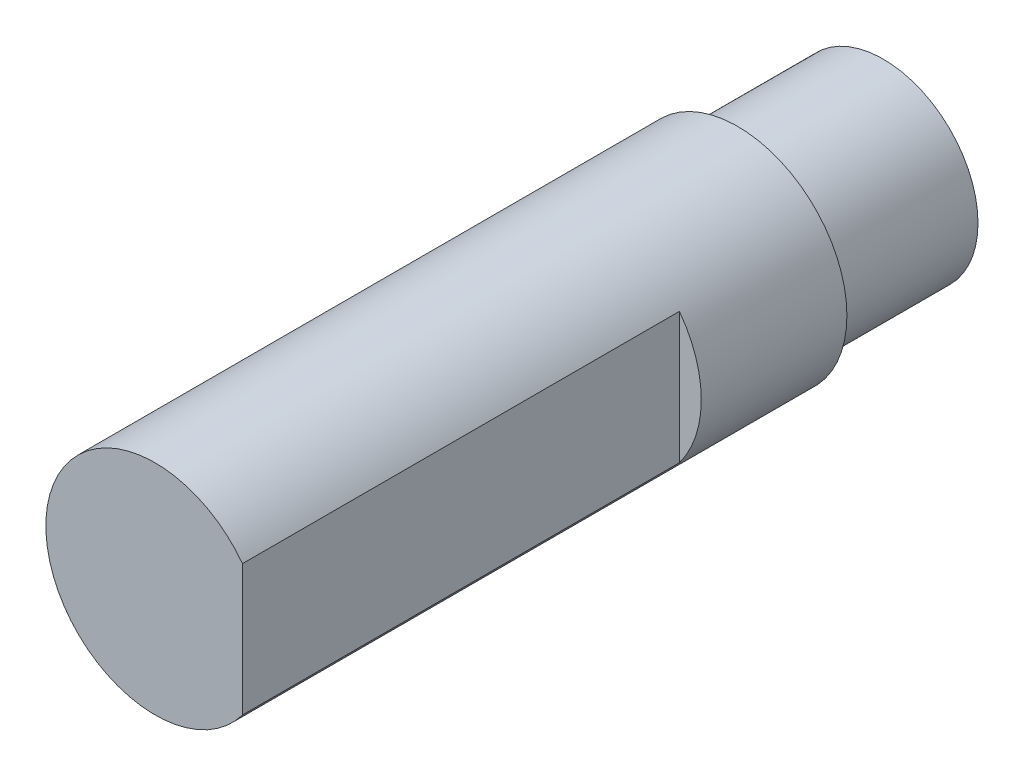
ISO-10303-21;
HEADER;
FILE_DESCRIPTION(('STEP AP214'),'2;1');
FILE_NAME('part.step','',(''),(''),'','','');
FILE_SCHEMA(('AUTOMOTIVE_DESIGN { 1 0 10303 214 1 1 1 1 }'));
ENDSEC;
DATA;
#1=APPLICATION_CONTEXT('core data for automotive mechanical design processes');
#2=APPLICATION_PROTOCOL_DEFINITION('international standard','automotive_design',2000,#1);
#3=PRODUCT_CONTEXT('',#1,'mechanical');
#4=PRODUCT('Part','Part','',(#3));
#5=PRODUCT_RELATED_PRODUCT_CATEGORY('part','',(#4));
#6=PRODUCT_DEFINITION_FORMATION('','',#4);
#7=PRODUCT_DEFINITION_CONTEXT('part definition',#1,'design');
#8=PRODUCT_DEFINITION('design','',#6,#7);
#9=PRODUCT_DEFINITION_SHAPE('','',#8);
#10=(LENGTH_UNIT() NAMED_UNIT(*) SI_UNIT(.MILLI.,.METRE.));
#11=(NAMED_UNIT(*) PLANE_ANGLE_UNIT() SI_UNIT($,.RADIAN.));
#12=(NAMED_UNIT(*) SI_UNIT($,.STERADIAN.) SOLID_ANGLE_UNIT());
#13=UNCERTAINTY_MEASURE_WITH_UNIT(LENGTH_MEASURE(1.E-05),#10,'distance_accuracy_value','');
#14=(GEOMETRIC_REPRESENTATION_CONTEXT(3) GLOBAL_UNCERTAINTY_ASSIGNED_CONTEXT((#13)) GLOBAL_UNIT_ASSIGNED_CONTEXT((#10,
#11,#12)) REPRESENTATION_CONTEXT('',''));
#15=CARTESIAN_POINT('',(0.,0.,0.));
#16=DIRECTION('',(0.,0.,1.));
#17=DIRECTION('',(1.,0.,0.));
#18=AXIS2_PLACEMENT_3D('',#15,#16,#17);
#19=CARTESIAN_POINT('',(0.,0.,22.));
#20=DIRECTION('',(0.,0.,-1.));
#21=DIRECTION('',(-1.,0.,0.));
#22=AXIS2_PLACEMENT_3D('',#19,#20,#21);
#23=CYLINDRICAL_SURFACE('',#22,3.);
#24=CARTESIAN_POINT('',(0.,0.,6.));
#25=DIRECTION('',(0.,0.,1.));
#26=DIRECTION('',(1.,0.,0.));
#27=AXIS2_PLACEMENT_3D('',#24,#25,#26);
#28=CIRCLE('',#27,3.);
#29=CARTESIAN_POINT('',(3.,0.,6.));
#30=VERTEX_POINT('',#29);
#31=EDGE_CURVE('E73',#30,#30,#28,.T.);
#32=ORIENTED_EDGE('',*,*,#31,.T.);
#33=EDGE_LOOP('',(#32));
#34=FACE_BOUND('',#33,.T.);
#35=DIRECTION('',(0.,0.,-1.));
#36=VECTOR('',#35,1.);
#37=CARTESIAN_POINT('',(2.4,-1.8,22.));
#38=LINE('',#37,#36);
#39=CARTESIAN_POINT('',(2.4,-1.8,22.));
#40=VERTEX_POINT('',#39);
#41=CARTESIAN_POINT('',(2.4,-1.8,10.));
#42=VERTEX_POINT('',#41);
#43=EDGE_CURVE('E68',#40,#42,#38,.T.);
#44=ORIENTED_EDGE('',*,*,#43,.F.);
#45=CARTESIAN_POINT('',(0.,0.,22.));
#46=DIRECTION('',(0.,0.,1.));
#47=DIRECTION('',(1.,0.,0.));
#48=AXIS2_PLACEMENT_3D('',#45,#46,#47);
#49=CIRCLE('',#48,3.);
#50=CARTESIAN_POINT('',(2.4,1.8,22.));
#51=VERTEX_POINT('',#50);
#52=EDGE_CURVE('E75',#51,#40,#49,.T.);
#53=ORIENTED_EDGE('',*,*,#52,.F.);
#54=DIRECTION('',(0.,0.,-1.));
#55=VECTOR('',#54,1.);
#56=CARTESIAN_POINT('',(2.4,1.8,22.));
#57=LINE('',#56,#55);
#58=CARTESIAN_POINT('',(2.4,1.8,10.));
#59=VERTEX_POINT('',#58);
#60=EDGE_CURVE('E52',#59,#51,#57,.F.);
#61=ORIENTED_EDGE('',*,*,#60,.F.);
#62=CARTESIAN_POINT('',(0.,0.,10.));
#63=DIRECTION('',(0.,0.,1.));
#64=DIRECTION('',(1.,0.,0.));
#65=AXIS2_PLACEMENT_3D('',#62,#63,#64);
#66=CIRCLE('',#65,3.);
#67=EDGE_CURVE('E11',#42,#59,#66,.T.);
#68=ORIENTED_EDGE('',*,*,#67,.F.);
#69=EDGE_LOOP('',(#44,#53,#61,#68));
#70=FACE_BOUND('',#69,.T.);
#71=ADVANCED_FACE('F39',(#34,#70),#23,.T.);
#72=CARTESIAN_POINT('',(0.,0.,22.));
#73=DIRECTION('',(0.,0.,1.));
#74=DIRECTION('',(1.,0.,0.));
#75=AXIS2_PLACEMENT_3D('',#72,#73,#74);
#76=PLANE('',#75);
#77=ORIENTED_EDGE('',*,*,#52,.T.);
#78=DIRECTION('',(0.,1.,0.));
#79=VECTOR('',#78,1.);
#80=CARTESIAN_POINT('',(2.4,0.,22.));
#81=LINE('',#80,#79);
#82=EDGE_CURVE('E46',#40,#51,#81,.T.);
#83=ORIENTED_EDGE('',*,*,#82,.T.);
#84=EDGE_LOOP('',(#77,#83));
#85=FACE_BOUND('',#84,.T.);
#86=ADVANCED_FACE('F85',(#85),#76,.T.);
#87=CARTESIAN_POINT('',(0.,0.,6.));
#88=DIRECTION('',(0.,0.,1.));
#89=DIRECTION('',(1.,0.,0.));
#90=AXIS2_PLACEMENT_3D('',#87,#88,#89);
#91=PLANE('',#90);
#92=CARTESIAN_POINT('',(0.,0.,6.));
#93=DIRECTION('',(0.,0.,1.));
#94=DIRECTION('',(1.,0.,0.));
#95=AXIS2_PLACEMENT_3D('',#92,#93,#94);
#96=CIRCLE('',#95,2.6);
#97=CARTESIAN_POINT('',(2.6,0.,6.));
#98=VERTEX_POINT('',#97);
#99=EDGE_CURVE('E67',#98,#98,#96,.T.);
#100=ORIENTED_EDGE('',*,*,#99,.T.);
#101=EDGE_LOOP('',(#100));
#102=FACE_BOUND('',#101,.T.);
#103=ORIENTED_EDGE('',*,*,#31,.F.);
#104=EDGE_LOOP('',(#103));
#105=FACE_BOUND('',#104,.T.);
#106=ADVANCED_FACE('F81',(#102,#105),#91,.F.);
#107=CARTESIAN_POINT('',(0.,0.,10.));
#108=DIRECTION('',(0.,0.,1.));
#109=DIRECTION('',(1.,0.,0.));
#110=AXIS2_PLACEMENT_3D('',#107,#108,#109);
#111=PLANE('',#110);
#112=ORIENTED_EDGE('',*,*,#67,.T.);
#113=DIRECTION('',(0.,-1.,0.));
#114=VECTOR('',#113,1.);
#115=CARTESIAN_POINT('',(2.4,4.,10.));
#116=LINE('',#115,#114);
#117=EDGE_CURVE('E63',#59,#42,#116,.T.);
#118=ORIENTED_EDGE('',*,*,#117,.T.);
#119=EDGE_LOOP('',(#112,#118));
#120=FACE_BOUND('',#119,.T.);
#121=ADVANCED_FACE('F61',(#120),#111,.T.);
#122=CARTESIAN_POINT('',(2.4,4.,22.2));
#123=DIRECTION('',(1.,0.,0.));
#124=DIRECTION('',(0.,0.,-1.));
#125=AXIS2_PLACEMENT_3D('',#122,#123,#124);
#126=PLANE('',#125);
#127=ORIENTED_EDGE('',*,*,#43,.T.);
#128=ORIENTED_EDGE('',*,*,#117,.F.);
#129=ORIENTED_EDGE('',*,*,#60,.T.);
#130=ORIENTED_EDGE('',*,*,#82,.F.);
#131=EDGE_LOOP('',(#127,#128,#129,#130));
#132=FACE_BOUND('',#131,.T.);
#133=ADVANCED_FACE('F70',(#132),#126,.T.);
#134=CARTESIAN_POINT('',(0.,0.,6.));
#135=DIRECTION('',(0.,0.,-1.));
#136=DIRECTION('',(-1.,0.,0.));
#137=AXIS2_PLACEMENT_3D('',#134,#135,#136);
#138=CYLINDRICAL_SURFACE('',#137,2.6);
#139=ORIENTED_EDGE('',*,*,#99,.F.);
#140=EDGE_LOOP('',(#139));
#141=FACE_BOUND('',#140,.T.);
#142=CARTESIAN_POINT('',(0.,0.,2.));
#143=DIRECTION('',(0.,0.,1.));
#144=DIRECTION('',(1.,0.,0.));
#145=AXIS2_PLACEMENT_3D('',#142,#143,#144);
#146=CIRCLE('',#145,2.6);
#147=CARTESIAN_POINT('',(2.6,0.,2.));
#148=VERTEX_POINT('',#147);
#149=EDGE_CURVE('E108',#148,#148,#146,.T.);
#150=ORIENTED_EDGE('',*,*,#149,.T.);
#151=EDGE_LOOP('',(#150));
#152=FACE_BOUND('',#151,.T.);
#153=ADVANCED_FACE('F98',(#141,#152),#138,.T.);
#154=CARTESIAN_POINT('',(0.,0.,2.));
#155=DIRECTION('',(0.,0.,1.));
#156=DIRECTION('',(1.,0.,0.));
#157=AXIS2_PLACEMENT_3D('',#154,#155,#156);
#158=PLANE('',#157);
#159=ORIENTED_EDGE('',*,*,#149,.F.);
#160=EDGE_LOOP('',(#159));
#161=FACE_BOUND('',#160,.T.);
#162=ADVANCED_FACE('F99',(#161),#158,.F.);
#163=CLOSED_SHELL('',(#71,#86,#106,#121,#133,#153,#162));
#164=MANIFOLD_SOLID_BREP('B2',#163);
#165=ADVANCED_BREP_SHAPE_REPRESENTATION('',(#18,#164),#14);
#166=SHAPE_DEFINITION_REPRESENTATION(#9,#165);
ENDSEC;
END-ISO-10303-21;
